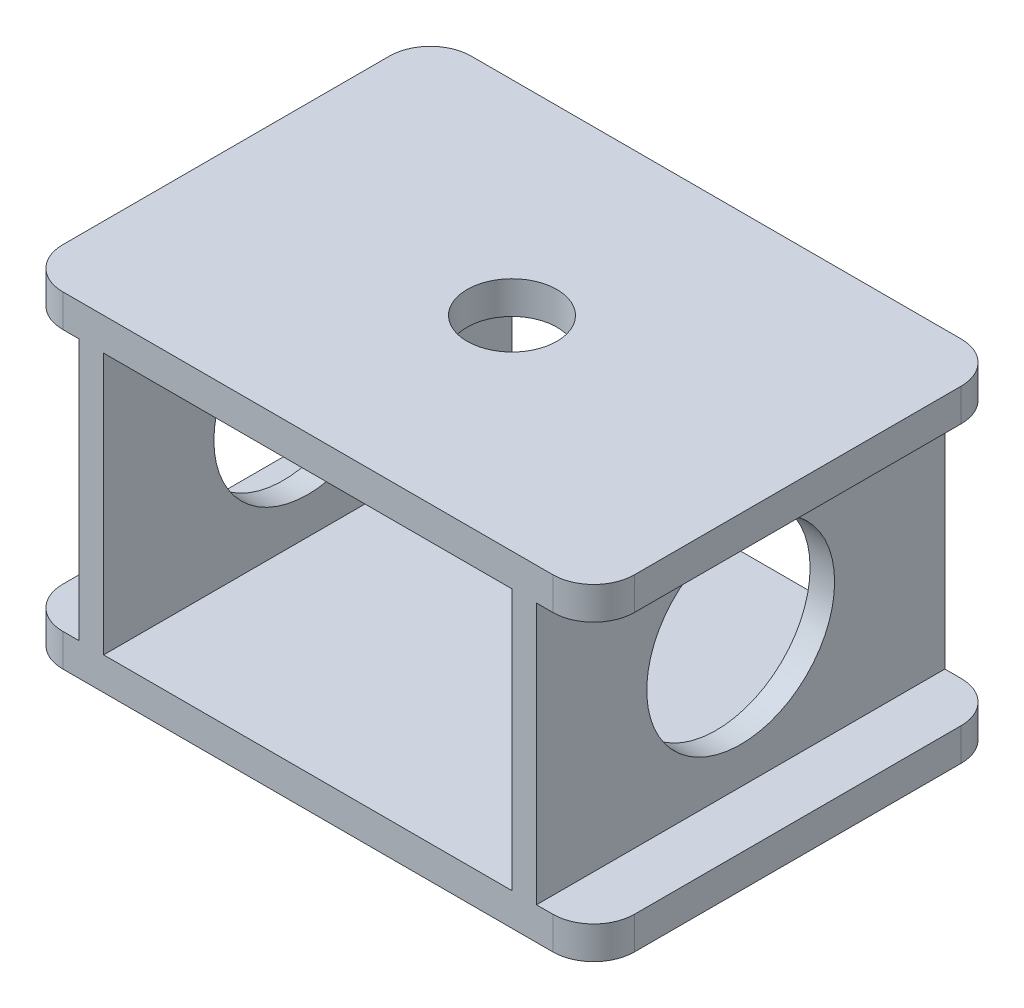
ISO-10303-21;
HEADER;
FILE_DESCRIPTION(('STEP AP214'),'2;1');
FILE_NAME('part.step','',(''),(''),'','','');
FILE_SCHEMA(('AUTOMOTIVE_DESIGN { 1 0 10303 214 1 1 1 1 }'));
ENDSEC;
DATA;
#1=APPLICATION_CONTEXT('core data for automotive mechanical design processes');
#2=APPLICATION_PROTOCOL_DEFINITION('international standard','automotive_design',2000,#1);
#3=PRODUCT_CONTEXT('',#1,'mechanical');
#4=PRODUCT('Part','Part','',(#3));
#5=PRODUCT_RELATED_PRODUCT_CATEGORY('part','',(#4));
#6=PRODUCT_DEFINITION_FORMATION('','',#4);
#7=PRODUCT_DEFINITION_CONTEXT('part definition',#1,'design');
#8=PRODUCT_DEFINITION('design','',#6,#7);
#9=PRODUCT_DEFINITION_SHAPE('','',#8);
#10=(LENGTH_UNIT() NAMED_UNIT(*) SI_UNIT(.MILLI.,.METRE.));
#11=(NAMED_UNIT(*) PLANE_ANGLE_UNIT() SI_UNIT($,.RADIAN.));
#12=(NAMED_UNIT(*) SI_UNIT($,.STERADIAN.) SOLID_ANGLE_UNIT());
#13=UNCERTAINTY_MEASURE_WITH_UNIT(LENGTH_MEASURE(1.E-05),#10,'distance_accuracy_value','');
#14=(GEOMETRIC_REPRESENTATION_CONTEXT(3) GLOBAL_UNCERTAINTY_ASSIGNED_CONTEXT((#13)) GLOBAL_UNIT_ASSIGNED_CONTEXT((#10,
#11,#12)) REPRESENTATION_CONTEXT('',''));
#15=CARTESIAN_POINT('',(0.,0.,0.));
#16=DIRECTION('',(0.,0.,1.));
#17=DIRECTION('',(1.,0.,0.));
#18=AXIS2_PLACEMENT_3D('',#15,#16,#17);
#19=CARTESIAN_POINT('',(30.,4.,20.));
#20=DIRECTION('',(0.,1.,0.));
#21=DIRECTION('',(0.,0.,1.));
#22=AXIS2_PLACEMENT_3D('',#19,#20,#21);
#23=PLANE('',#22);
#24=DIRECTION('',(0.,0.,1.));
#25=VECTOR('',#24,1.);
#26=CARTESIAN_POINT('',(-28.,4.,-25.));
#27=LINE('',#26,#25);
#28=CARTESIAN_POINT('',(-28.,4.,-25.));
#29=VERTEX_POINT('',#28);
#30=CARTESIAN_POINT('',(-28.,4.,25.));
#31=VERTEX_POINT('',#30);
#32=EDGE_CURVE('E322',#29,#31,#27,.T.);
#33=ORIENTED_EDGE('',*,*,#32,.F.);
#34=DIRECTION('',(-1.,0.,0.));
#35=VECTOR('',#34,1.);
#36=CARTESIAN_POINT('',(-30.,4.,-25.));
#37=LINE('',#36,#35);
#38=CARTESIAN_POINT('',(-30.,4.,-25.));
#39=VERTEX_POINT('',#38);
#40=EDGE_CURVE('E384',#29,#39,#37,.T.);
#41=ORIENTED_EDGE('',*,*,#40,.T.);
#42=CARTESIAN_POINT('',(-30.,4.,-20.));
#43=DIRECTION('',(0.,1.,0.));
#44=DIRECTION('',(0.,0.,1.));
#45=AXIS2_PLACEMENT_3D('',#42,#43,#44);
#46=CIRCLE('',#45,5.);
#47=CARTESIAN_POINT('',(-35.,4.,-20.));
#48=VERTEX_POINT('',#47);
#49=EDGE_CURVE('E388',#39,#48,#46,.T.);
#50=ORIENTED_EDGE('',*,*,#49,.T.);
#51=DIRECTION('',(0.,0.,1.));
#52=VECTOR('',#51,1.);
#53=CARTESIAN_POINT('',(-35.,4.,-20.));
#54=LINE('',#53,#52);
#55=CARTESIAN_POINT('',(-35.,4.,20.));
#56=VERTEX_POINT('',#55);
#57=EDGE_CURVE('E392',#48,#56,#54,.T.);
#58=ORIENTED_EDGE('',*,*,#57,.T.);
#59=CARTESIAN_POINT('',(-30.,4.,20.));
#60=DIRECTION('',(0.,1.,0.));
#61=DIRECTION('',(0.,0.,1.));
#62=AXIS2_PLACEMENT_3D('',#59,#60,#61);
#63=CIRCLE('',#62,5.);
#64=CARTESIAN_POINT('',(-30.,4.,25.));
#65=VERTEX_POINT('',#64);
#66=EDGE_CURVE('E395',#56,#65,#63,.T.);
#67=ORIENTED_EDGE('',*,*,#66,.T.);
#68=DIRECTION('',(1.,0.,0.));
#69=VECTOR('',#68,1.);
#70=CARTESIAN_POINT('',(-30.,4.,25.));
#71=LINE('',#70,#69);
#72=EDGE_CURVE('E399',#65,#31,#71,.T.);
#73=ORIENTED_EDGE('',*,*,#72,.T.);
#74=EDGE_LOOP('',(#33,#41,#50,#58,#67,#73));
#75=FACE_BOUND('',#74,.T.);
#76=ADVANCED_FACE('F45',(#75),#23,.T.);
#77=DIRECTION('',(0.,0.,-1.));
#78=VECTOR('',#77,1.);
#79=CARTESIAN_POINT('',(-25.,4.,-25.));
#80=LINE('',#79,#78);
#81=CARTESIAN_POINT('',(-25.,4.,25.));
#82=VERTEX_POINT('',#81);
#83=CARTESIAN_POINT('',(-25.,4.,-25.));
#84=VERTEX_POINT('',#83);
#85=EDGE_CURVE('E317',#82,#84,#80,.T.);
#86=ORIENTED_EDGE('',*,*,#85,.F.);
#87=CARTESIAN_POINT('',(25.,4.,25.));
#88=VERTEX_POINT('',#87);
#89=EDGE_CURVE('E70',#82,#88,#71,.T.);
#90=ORIENTED_EDGE('',*,*,#89,.T.);
#91=DIRECTION('',(0.,0.,1.));
#92=VECTOR('',#91,1.);
#93=CARTESIAN_POINT('',(25.,4.,-25.));
#94=LINE('',#93,#92);
#95=CARTESIAN_POINT('',(25.,4.,-25.));
#96=VERTEX_POINT('',#95);
#97=EDGE_CURVE('E326',#96,#88,#94,.T.);
#98=ORIENTED_EDGE('',*,*,#97,.F.);
#99=EDGE_CURVE('E389',#96,#84,#37,.T.);
#100=ORIENTED_EDGE('',*,*,#99,.T.);
#101=EDGE_LOOP('',(#86,#90,#98,#100));
#102=FACE_BOUND('',#101,.T.);
#103=ADVANCED_FACE('F477',(#102),#23,.T.);
#104=CARTESIAN_POINT('',(30.,4.,20.));
#105=DIRECTION('',(0.,-1.,0.));
#106=DIRECTION('',(0.,0.,-1.));
#107=AXIS2_PLACEMENT_3D('',#104,#105,#106);
#108=CYLINDRICAL_SURFACE('',#107,5.);
#109=CARTESIAN_POINT('',(30.,0.,20.));
#110=DIRECTION('',(0.,1.,0.));
#111=DIRECTION('',(0.,0.,1.));
#112=AXIS2_PLACEMENT_3D('',#109,#110,#111);
#113=CIRCLE('',#112,5.);
#114=CARTESIAN_POINT('',(30.,0.,25.));
#115=VERTEX_POINT('',#114);
#116=CARTESIAN_POINT('',(35.,0.,20.));
#117=VERTEX_POINT('',#116);
#118=EDGE_CURVE('E345',#115,#117,#113,.T.);
#119=ORIENTED_EDGE('',*,*,#118,.T.);
#120=DIRECTION('',(0.,-1.,0.));
#121=VECTOR('',#120,1.);
#122=CARTESIAN_POINT('',(35.,4.,20.));
#123=LINE('',#122,#121);
#124=CARTESIAN_POINT('',(35.,4.,20.));
#125=VERTEX_POINT('',#124);
#126=EDGE_CURVE('E11',#125,#117,#123,.T.);
#127=ORIENTED_EDGE('',*,*,#126,.F.);
#128=CARTESIAN_POINT('',(30.,4.,20.));
#129=DIRECTION('',(0.,1.,0.));
#130=DIRECTION('',(0.,0.,1.));
#131=AXIS2_PLACEMENT_3D('',#128,#129,#130);
#132=CIRCLE('',#131,5.);
#133=CARTESIAN_POINT('',(30.,4.,25.));
#134=VERTEX_POINT('',#133);
#135=EDGE_CURVE('E373',#134,#125,#132,.T.);
#136=ORIENTED_EDGE('',*,*,#135,.F.);
#137=DIRECTION('',(0.,-1.,0.));
#138=VECTOR('',#137,1.);
#139=CARTESIAN_POINT('',(30.,4.,25.));
#140=LINE('',#139,#138);
#141=EDGE_CURVE('E402',#134,#115,#140,.T.);
#142=ORIENTED_EDGE('',*,*,#141,.T.);
#143=EDGE_LOOP('',(#119,#127,#136,#142));
#144=FACE_BOUND('',#143,.T.);
#145=ADVANCED_FACE('F47',(#144),#108,.T.);
#146=CARTESIAN_POINT('',(35.,4.,-20.));
#147=DIRECTION('',(-1.,0.,0.));
#148=DIRECTION('',(0.,0.,1.));
#149=AXIS2_PLACEMENT_3D('',#146,#147,#148);
#150=PLANE('',#149);
#151=DIRECTION('',(0.,0.,-1.));
#152=VECTOR('',#151,1.);
#153=CARTESIAN_POINT('',(35.,0.,-20.));
#154=LINE('',#153,#152);
#155=CARTESIAN_POINT('',(35.,0.,-20.));
#156=VERTEX_POINT('',#155);
#157=EDGE_CURVE('E406',#117,#156,#154,.T.);
#158=ORIENTED_EDGE('',*,*,#157,.T.);
#159=DIRECTION('',(0.,-1.,0.));
#160=VECTOR('',#159,1.);
#161=CARTESIAN_POINT('',(35.,4.,-20.));
#162=LINE('',#161,#160);
#163=CARTESIAN_POINT('',(35.,4.,-20.));
#164=VERTEX_POINT('',#163);
#165=EDGE_CURVE('E55',#164,#156,#162,.T.);
#166=ORIENTED_EDGE('',*,*,#165,.F.);
#167=DIRECTION('',(0.,0.,-1.));
#168=VECTOR('',#167,1.);
#169=CARTESIAN_POINT('',(35.,4.,-20.));
#170=LINE('',#169,#168);
#171=EDGE_CURVE('E377',#125,#164,#170,.T.);
#172=ORIENTED_EDGE('',*,*,#171,.F.);
#173=ORIENTED_EDGE('',*,*,#126,.T.);
#174=EDGE_LOOP('',(#158,#166,#172,#173));
#175=FACE_BOUND('',#174,.T.);
#176=ADVANCED_FACE('F568',(#175),#150,.F.);
#177=CARTESIAN_POINT('',(30.,4.,-20.));
#178=DIRECTION('',(0.,-1.,0.));
#179=DIRECTION('',(0.,0.,-1.));
#180=AXIS2_PLACEMENT_3D('',#177,#178,#179);
#181=CYLINDRICAL_SURFACE('',#180,5.);
#182=CARTESIAN_POINT('',(30.,0.,-20.));
#183=DIRECTION('',(0.,1.,0.));
#184=DIRECTION('',(0.,0.,-1.));
#185=AXIS2_PLACEMENT_3D('',#182,#183,#184);
#186=CIRCLE('',#185,5.);
#187=CARTESIAN_POINT('',(30.,0.,-25.));
#188=VERTEX_POINT('',#187);
#189=EDGE_CURVE('E409',#156,#188,#186,.T.);
#190=ORIENTED_EDGE('',*,*,#189,.T.);
#191=DIRECTION('',(0.,-1.,0.));
#192=VECTOR('',#191,1.);
#193=CARTESIAN_POINT('',(30.,4.,-25.));
#194=LINE('',#193,#192);
#195=CARTESIAN_POINT('',(30.,4.,-25.));
#196=VERTEX_POINT('',#195);
#197=EDGE_CURVE('E445',#196,#188,#194,.T.);
#198=ORIENTED_EDGE('',*,*,#197,.F.);
#199=CARTESIAN_POINT('',(30.,4.,-20.));
#200=DIRECTION('',(0.,1.,0.));
#201=DIRECTION('',(0.,0.,-1.));
#202=AXIS2_PLACEMENT_3D('',#199,#200,#201);
#203=CIRCLE('',#202,5.);
#204=EDGE_CURVE('E381',#164,#196,#203,.T.);
#205=ORIENTED_EDGE('',*,*,#204,.F.);
#206=ORIENTED_EDGE('',*,*,#165,.T.);
#207=EDGE_LOOP('',(#190,#198,#205,#206));
#208=FACE_BOUND('',#207,.T.);
#209=ADVANCED_FACE('F455',(#208),#181,.T.);
#210=CARTESIAN_POINT('',(-30.,4.,-25.));
#211=DIRECTION('',(0.,0.,1.));
#212=DIRECTION('',(1.,0.,0.));
#213=AXIS2_PLACEMENT_3D('',#210,#211,#212);
#214=PLANE('',#213);
#215=DIRECTION('',(0.,-1.,0.));
#216=VECTOR('',#215,1.);
#217=CARTESIAN_POINT('',(25.,36.,-25.));
#218=LINE('',#217,#216);
#219=CARTESIAN_POINT('',(25.,36.,-25.));
#220=VERTEX_POINT('',#219);
#221=EDGE_CURVE('E356',#220,#96,#218,.T.);
#222=ORIENTED_EDGE('',*,*,#221,.F.);
#223=DIRECTION('',(-1.,0.,0.));
#224=VECTOR('',#223,1.);
#225=CARTESIAN_POINT('',(30.,36.,-25.));
#226=LINE('',#225,#224);
#227=CARTESIAN_POINT('',(-25.,36.,-25.));
#228=VERTEX_POINT('',#227);
#229=EDGE_CURVE('E287',#220,#228,#226,.T.);
#230=ORIENTED_EDGE('',*,*,#229,.T.);
#231=DIRECTION('',(0.,-1.,0.));
#232=VECTOR('',#231,1.);
#233=CARTESIAN_POINT('',(-25.,36.,-25.));
#234=LINE('',#233,#232);
#235=EDGE_CURVE('E333',#228,#84,#234,.T.);
#236=ORIENTED_EDGE('',*,*,#235,.T.);
#237=ORIENTED_EDGE('',*,*,#99,.F.);
#238=EDGE_LOOP('',(#222,#230,#236,#237));
#239=FACE_BOUND('',#238,.T.);
#240=DIRECTION('',(-1.,0.,0.));
#241=VECTOR('',#240,1.);
#242=CARTESIAN_POINT('',(-30.,0.,-25.));
#243=LINE('',#242,#241);
#244=CARTESIAN_POINT('',(-30.,0.,-25.));
#245=VERTEX_POINT('',#244);
#246=EDGE_CURVE('E412',#188,#245,#243,.T.);
#247=ORIENTED_EDGE('',*,*,#246,.T.);
#248=DIRECTION('',(0.,-1.,0.));
#249=VECTOR('',#248,1.);
#250=CARTESIAN_POINT('',(-30.,4.,-25.));
#251=LINE('',#250,#249);
#252=EDGE_CURVE('E441',#39,#245,#251,.T.);
#253=ORIENTED_EDGE('',*,*,#252,.F.);
#254=ORIENTED_EDGE('',*,*,#40,.F.);
#255=DIRECTION('',(0.,-1.,0.));
#256=VECTOR('',#255,1.);
#257=CARTESIAN_POINT('',(-28.,36.,-25.));
#258=LINE('',#257,#256);
#259=CARTESIAN_POINT('',(-28.,36.,-25.));
#260=VERTEX_POINT('',#259);
#261=EDGE_CURVE('E321',#260,#29,#258,.T.);
#262=ORIENTED_EDGE('',*,*,#261,.F.);
#263=CARTESIAN_POINT('',(-30.,36.,-25.));
#264=VERTEX_POINT('',#263);
#265=EDGE_CURVE('E226',#260,#264,#226,.T.);
#266=ORIENTED_EDGE('',*,*,#265,.T.);
#267=DIRECTION('',(0.,-1.,0.));
#268=VECTOR('',#267,1.);
#269=CARTESIAN_POINT('',(-30.,40.,-25.));
#270=LINE('',#269,#268);
#271=CARTESIAN_POINT('',(-30.,40.,-25.));
#272=VERTEX_POINT('',#271);
#273=EDGE_CURVE('E222',#272,#264,#270,.T.);
#274=ORIENTED_EDGE('',*,*,#273,.F.);
#275=DIRECTION('',(-1.,0.,0.));
#276=VECTOR('',#275,1.);
#277=CARTESIAN_POINT('',(28.,40.,-25.));
#278=LINE('',#277,#276);
#279=CARTESIAN_POINT('',(30.,40.,-25.));
#280=VERTEX_POINT('',#279);
#281=EDGE_CURVE('E207',#280,#272,#278,.T.);
#282=ORIENTED_EDGE('',*,*,#281,.F.);
#283=DIRECTION('',(0.,-1.,0.));
#284=VECTOR('',#283,1.);
#285=CARTESIAN_POINT('',(30.,40.,-25.));
#286=LINE('',#285,#284);
#287=CARTESIAN_POINT('',(30.,36.,-25.));
#288=VERTEX_POINT('',#287);
#289=EDGE_CURVE('E257',#280,#288,#286,.T.);
#290=ORIENTED_EDGE('',*,*,#289,.T.);
#291=CARTESIAN_POINT('',(28.,36.,-25.));
#292=VERTEX_POINT('',#291);
#293=EDGE_CURVE('E219',#288,#292,#226,.T.);
#294=ORIENTED_EDGE('',*,*,#293,.T.);
#295=DIRECTION('',(0.,-1.,0.));
#296=VECTOR('',#295,1.);
#297=CARTESIAN_POINT('',(28.,36.,-25.));
#298=LINE('',#297,#296);
#299=CARTESIAN_POINT('',(28.,4.,-25.));
#300=VERTEX_POINT('',#299);
#301=EDGE_CURVE('E352',#292,#300,#298,.T.);
#302=ORIENTED_EDGE('',*,*,#301,.T.);
#303=EDGE_CURVE('E385',#196,#300,#37,.T.);
#304=ORIENTED_EDGE('',*,*,#303,.F.);
#305=ORIENTED_EDGE('',*,*,#197,.T.);
#306=EDGE_LOOP('',(#247,#253,#254,#262,#266,#274,#282,#290,#294,#302,#304,#305));
#307=FACE_BOUND('',#306,.T.);
#308=ADVANCED_FACE('F223',(#239,#307),#214,.F.);
#309=CARTESIAN_POINT('',(-30.,4.,-20.));
#310=DIRECTION('',(0.,-1.,0.));
#311=DIRECTION('',(0.,0.,-1.));
#312=AXIS2_PLACEMENT_3D('',#309,#310,#311);
#313=CYLINDRICAL_SURFACE('',#312,5.);
#314=CARTESIAN_POINT('',(-30.,0.,-20.));
#315=DIRECTION('',(0.,1.,0.));
#316=DIRECTION('',(0.,0.,1.));
#317=AXIS2_PLACEMENT_3D('',#314,#315,#316);
#318=CIRCLE('',#317,5.);
#319=CARTESIAN_POINT('',(-35.,0.,-20.));
#320=VERTEX_POINT('',#319);
#321=EDGE_CURVE('E415',#245,#320,#318,.T.);
#322=ORIENTED_EDGE('',*,*,#321,.T.);
#323=DIRECTION('',(0.,-1.,0.));
#324=VECTOR('',#323,1.);
#325=CARTESIAN_POINT('',(-35.,4.,-20.));
#326=LINE('',#325,#324);
#327=EDGE_CURVE('E437',#48,#320,#326,.T.);
#328=ORIENTED_EDGE('',*,*,#327,.F.);
#329=ORIENTED_EDGE('',*,*,#49,.F.);
#330=ORIENTED_EDGE('',*,*,#252,.T.);
#331=EDGE_LOOP('',(#322,#328,#329,#330));
#332=FACE_BOUND('',#331,.T.);
#333=ADVANCED_FACE('F469',(#332),#313,.T.);
#334=CARTESIAN_POINT('',(-35.,4.,-20.));
#335=DIRECTION('',(1.,0.,0.));
#336=DIRECTION('',(0.,0.,-1.));
#337=AXIS2_PLACEMENT_3D('',#334,#335,#336);
#338=PLANE('',#337);
#339=DIRECTION('',(0.,0.,1.));
#340=VECTOR('',#339,1.);
#341=CARTESIAN_POINT('',(-35.,0.,-20.));
#342=LINE('',#341,#340);
#343=CARTESIAN_POINT('',(-35.,0.,20.));
#344=VERTEX_POINT('',#343);
#345=EDGE_CURVE('E418',#320,#344,#342,.T.);
#346=ORIENTED_EDGE('',*,*,#345,.T.);
#347=DIRECTION('',(0.,-1.,0.));
#348=VECTOR('',#347,1.);
#349=CARTESIAN_POINT('',(-35.,4.,20.));
#350=LINE('',#349,#348);
#351=EDGE_CURVE('E433',#56,#344,#350,.T.);
#352=ORIENTED_EDGE('',*,*,#351,.F.);
#353=ORIENTED_EDGE('',*,*,#57,.F.);
#354=ORIENTED_EDGE('',*,*,#327,.T.);
#355=EDGE_LOOP('',(#346,#352,#353,#354));
#356=FACE_BOUND('',#355,.T.);
#357=ADVANCED_FACE('F556',(#356),#338,.F.);
#358=CARTESIAN_POINT('',(-30.,4.,20.));
#359=DIRECTION('',(0.,-1.,0.));
#360=DIRECTION('',(0.,0.,-1.));
#361=AXIS2_PLACEMENT_3D('',#358,#359,#360);
#362=CYLINDRICAL_SURFACE('',#361,5.);
#363=CARTESIAN_POINT('',(-30.,0.,20.));
#364=DIRECTION('',(0.,1.,0.));
#365=DIRECTION('',(0.,0.,1.));
#366=AXIS2_PLACEMENT_3D('',#363,#364,#365);
#367=CIRCLE('',#366,5.);
#368=CARTESIAN_POINT('',(-30.,0.,25.));
#369=VERTEX_POINT('',#368);
#370=EDGE_CURVE('E421',#344,#369,#367,.T.);
#371=ORIENTED_EDGE('',*,*,#370,.T.);
#372=DIRECTION('',(0.,-1.,0.));
#373=VECTOR('',#372,1.);
#374=CARTESIAN_POINT('',(-30.,4.,25.));
#375=LINE('',#374,#373);
#376=EDGE_CURVE('E429',#65,#369,#375,.T.);
#377=ORIENTED_EDGE('',*,*,#376,.F.);
#378=ORIENTED_EDGE('',*,*,#66,.F.);
#379=ORIENTED_EDGE('',*,*,#351,.T.);
#380=EDGE_LOOP('',(#371,#377,#378,#379));
#381=FACE_BOUND('',#380,.T.);
#382=ADVANCED_FACE('F550',(#381),#362,.T.);
#383=CARTESIAN_POINT('',(-30.,4.,25.));
#384=DIRECTION('',(0.,0.,-1.));
#385=DIRECTION('',(-1.,0.,0.));
#386=AXIS2_PLACEMENT_3D('',#383,#384,#385);
#387=PLANE('',#386);
#388=DIRECTION('',(0.,-1.,0.));
#389=VECTOR('',#388,1.);
#390=CARTESIAN_POINT('',(28.,36.,25.));
#391=LINE('',#390,#389);
#392=CARTESIAN_POINT('',(28.,36.,25.));
#393=VERTEX_POINT('',#392);
#394=CARTESIAN_POINT('',(28.,4.,25.));
#395=VERTEX_POINT('',#394);
#396=EDGE_CURVE('E348',#393,#395,#391,.T.);
#397=ORIENTED_EDGE('',*,*,#396,.F.);
#398=DIRECTION('',(1.,0.,0.));
#399=VECTOR('',#398,1.);
#400=CARTESIAN_POINT('',(28.,36.,25.));
#401=LINE('',#400,#399);
#402=CARTESIAN_POINT('',(30.,36.,25.));
#403=VERTEX_POINT('',#402);
#404=EDGE_CURVE('E269',#393,#403,#401,.T.);
#405=ORIENTED_EDGE('',*,*,#404,.T.);
#406=DIRECTION('',(0.,-1.,0.));
#407=VECTOR('',#406,1.);
#408=CARTESIAN_POINT('',(30.,40.,25.));
#409=LINE('',#408,#407);
#410=CARTESIAN_POINT('',(30.,40.,25.));
#411=VERTEX_POINT('',#410);
#412=EDGE_CURVE('E298',#411,#403,#409,.T.);
#413=ORIENTED_EDGE('',*,*,#412,.F.);
#414=DIRECTION('',(1.,0.,0.));
#415=VECTOR('',#414,1.);
#416=CARTESIAN_POINT('',(-30.,40.,25.));
#417=LINE('',#416,#415);
#418=CARTESIAN_POINT('',(-30.,40.,25.));
#419=VERTEX_POINT('',#418);
#420=EDGE_CURVE('E246',#419,#411,#417,.T.);
#421=ORIENTED_EDGE('',*,*,#420,.F.);
#422=DIRECTION('',(0.,-1.,0.));
#423=VECTOR('',#422,1.);
#424=CARTESIAN_POINT('',(-30.,40.,25.));
#425=LINE('',#424,#423);
#426=CARTESIAN_POINT('',(-30.,36.,25.));
#427=VERTEX_POINT('',#426);
#428=EDGE_CURVE('E302',#419,#427,#425,.T.);
#429=ORIENTED_EDGE('',*,*,#428,.T.);
#430=CARTESIAN_POINT('',(-28.,36.,25.));
#431=VERTEX_POINT('',#430);
#432=EDGE_CURVE('E270',#427,#431,#401,.T.);
#433=ORIENTED_EDGE('',*,*,#432,.T.);
#434=DIRECTION('',(0.,-1.,0.));
#435=VECTOR('',#434,1.);
#436=CARTESIAN_POINT('',(-28.,36.,25.));
#437=LINE('',#436,#435);
#438=EDGE_CURVE('E341',#431,#31,#437,.T.);
#439=ORIENTED_EDGE('',*,*,#438,.T.);
#440=ORIENTED_EDGE('',*,*,#72,.F.);
#441=ORIENTED_EDGE('',*,*,#376,.T.);
#442=DIRECTION('',(1.,0.,0.));
#443=VECTOR('',#442,1.);
#444=CARTESIAN_POINT('',(-30.,0.,25.));
#445=LINE('',#444,#443);
#446=EDGE_CURVE('E378',#369,#115,#445,.T.);
#447=ORIENTED_EDGE('',*,*,#446,.T.);
#448=ORIENTED_EDGE('',*,*,#141,.F.);
#449=EDGE_CURVE('E398',#395,#134,#71,.T.);
#450=ORIENTED_EDGE('',*,*,#449,.F.);
#451=EDGE_LOOP('',(#397,#405,#413,#421,#429,#433,#439,#440,#441,#447,#448,#450));
#452=FACE_BOUND('',#451,.T.);
#453=CARTESIAN_POINT('',(-25.,36.,25.));
#454=VERTEX_POINT('',#453);
#455=CARTESIAN_POINT('',(25.,36.,25.));
#456=VERTEX_POINT('',#455);
#457=EDGE_CURVE('E275',#454,#456,#401,.T.);
#458=ORIENTED_EDGE('',*,*,#457,.T.);
#459=DIRECTION('',(0.,-1.,0.));
#460=VECTOR('',#459,1.);
#461=CARTESIAN_POINT('',(25.,36.,25.));
#462=LINE('',#461,#460);
#463=EDGE_CURVE('E230',#456,#88,#462,.T.);
#464=ORIENTED_EDGE('',*,*,#463,.T.);
#465=ORIENTED_EDGE('',*,*,#89,.F.);
#466=DIRECTION('',(0.,-1.,0.));
#467=VECTOR('',#466,1.);
#468=CARTESIAN_POINT('',(-25.,36.,25.));
#469=LINE('',#468,#467);
#470=EDGE_CURVE('E337',#454,#82,#469,.T.);
#471=ORIENTED_EDGE('',*,*,#470,.F.);
#472=EDGE_LOOP('',(#458,#464,#465,#471));
#473=FACE_BOUND('',#472,.T.);
#474=ADVANCED_FACE('F544',(#452,#473),#387,.F.);
#475=DIRECTION('',(0.,0.,-1.));
#476=VECTOR('',#475,1.);
#477=CARTESIAN_POINT('',(28.,4.,-25.));
#478=LINE('',#477,#476);
#479=EDGE_CURVE('E62',#395,#300,#478,.T.);
#480=ORIENTED_EDGE('',*,*,#479,.F.);
#481=ORIENTED_EDGE('',*,*,#449,.T.);
#482=ORIENTED_EDGE('',*,*,#135,.T.);
#483=ORIENTED_EDGE('',*,*,#171,.T.);
#484=ORIENTED_EDGE('',*,*,#204,.T.);
#485=ORIENTED_EDGE('',*,*,#303,.T.);
#486=EDGE_LOOP('',(#480,#481,#482,#483,#484,#485));
#487=FACE_BOUND('',#486,.T.);
#488=ADVANCED_FACE('F536',(#487),#23,.T.);
#489=CARTESIAN_POINT('',(30.,0.,20.));
#490=DIRECTION('',(0.,1.,0.));
#491=DIRECTION('',(0.,0.,1.));
#492=AXIS2_PLACEMENT_3D('',#489,#490,#491);
#493=PLANE('',#492);
#494=ORIENTED_EDGE('',*,*,#118,.F.);
#495=ORIENTED_EDGE('',*,*,#446,.F.);
#496=ORIENTED_EDGE('',*,*,#370,.F.);
#497=ORIENTED_EDGE('',*,*,#345,.F.);
#498=ORIENTED_EDGE('',*,*,#321,.F.);
#499=ORIENTED_EDGE('',*,*,#246,.F.);
#500=ORIENTED_EDGE('',*,*,#189,.F.);
#501=ORIENTED_EDGE('',*,*,#157,.F.);
#502=EDGE_LOOP('',(#494,#495,#496,#497,#498,#499,#500,#501));
#503=FACE_BOUND('',#502,.T.);
#504=ADVANCED_FACE('F461',(#503),#493,.F.);
#505=CARTESIAN_POINT('',(25.,36.,-25.));
#506=DIRECTION('',(1.,0.,0.));
#507=DIRECTION('',(0.,0.,-1.));
#508=AXIS2_PLACEMENT_3D('',#505,#506,#507);
#509=PLANE('',#508);
#510=CARTESIAN_POINT('',(25.,20.,0.));
#511=DIRECTION('',(1.,0.,0.));
#512=DIRECTION('',(0.,0.,-1.));
#513=AXIS2_PLACEMENT_3D('',#510,#511,#512);
#514=CIRCLE('',#513,11.5);
#515=CARTESIAN_POINT('',(25.,20.,-11.5));
#516=VERTEX_POINT('',#515);
#517=EDGE_CURVE('E262',#516,#516,#514,.T.);
#518=ORIENTED_EDGE('',*,*,#517,.T.);
#519=EDGE_LOOP('',(#518));
#520=FACE_BOUND('',#519,.T.);
#521=ORIENTED_EDGE('',*,*,#97,.T.);
#522=ORIENTED_EDGE('',*,*,#463,.F.);
#523=DIRECTION('',(0.,0.,1.));
#524=VECTOR('',#523,1.);
#525=CARTESIAN_POINT('',(25.,36.,-25.));
#526=LINE('',#525,#524);
#527=EDGE_CURVE('E363',#220,#456,#526,.T.);
#528=ORIENTED_EDGE('',*,*,#527,.F.);
#529=ORIENTED_EDGE('',*,*,#221,.T.);
#530=EDGE_LOOP('',(#521,#522,#528,#529));
#531=FACE_BOUND('',#530,.T.);
#532=ADVANCED_FACE('F548',(#520,#531),#509,.F.);
#533=CARTESIAN_POINT('',(28.,36.,-25.));
#534=DIRECTION('',(-1.,0.,0.));
#535=DIRECTION('',(0.,0.,1.));
#536=AXIS2_PLACEMENT_3D('',#533,#534,#535);
#537=PLANE('',#536);
#538=CARTESIAN_POINT('',(28.,20.,0.));
#539=DIRECTION('',(1.,0.,0.));
#540=DIRECTION('',(0.,0.,-1.));
#541=AXIS2_PLACEMENT_3D('',#538,#539,#540);
#542=CIRCLE('',#541,11.5);
#543=CARTESIAN_POINT('',(28.,20.,-11.5));
#544=VERTEX_POINT('',#543);
#545=EDGE_CURVE('E500',#544,#544,#542,.T.);
#546=ORIENTED_EDGE('',*,*,#545,.F.);
#547=EDGE_LOOP('',(#546));
#548=FACE_BOUND('',#547,.T.);
#549=ORIENTED_EDGE('',*,*,#479,.T.);
#550=ORIENTED_EDGE('',*,*,#301,.F.);
#551=DIRECTION('',(0.,0.,-1.));
#552=VECTOR('',#551,1.);
#553=CARTESIAN_POINT('',(28.,36.,-25.));
#554=LINE('',#553,#552);
#555=EDGE_CURVE('E360',#393,#292,#554,.T.);
#556=ORIENTED_EDGE('',*,*,#555,.F.);
#557=ORIENTED_EDGE('',*,*,#396,.T.);
#558=EDGE_LOOP('',(#549,#550,#556,#557));
#559=FACE_BOUND('',#558,.T.);
#560=ADVANCED_FACE('F611',(#548,#559),#537,.F.);
#561=CARTESIAN_POINT('',(-28.,36.,-25.));
#562=DIRECTION('',(1.,0.,0.));
#563=DIRECTION('',(0.,0.,-1.));
#564=AXIS2_PLACEMENT_3D('',#561,#562,#563);
#565=PLANE('',#564);
#566=CARTESIAN_POINT('',(-28.,20.,0.));
#567=DIRECTION('',(1.,0.,0.));
#568=DIRECTION('',(0.,0.,-1.));
#569=AXIS2_PLACEMENT_3D('',#566,#567,#568);
#570=CIRCLE('',#569,11.5);
#571=CARTESIAN_POINT('',(-28.,20.,-11.5));
#572=VERTEX_POINT('',#571);
#573=EDGE_CURVE('E494',#572,#572,#570,.T.);
#574=ORIENTED_EDGE('',*,*,#573,.T.);
#575=EDGE_LOOP('',(#574));
#576=FACE_BOUND('',#575,.T.);
#577=ORIENTED_EDGE('',*,*,#32,.T.);
#578=ORIENTED_EDGE('',*,*,#438,.F.);
#579=DIRECTION('',(0.,0.,1.));
#580=VECTOR('',#579,1.);
#581=CARTESIAN_POINT('',(-28.,36.,-25.));
#582=LINE('',#581,#580);
#583=EDGE_CURVE('E312',#260,#431,#582,.T.);
#584=ORIENTED_EDGE('',*,*,#583,.F.);
#585=ORIENTED_EDGE('',*,*,#261,.T.);
#586=EDGE_LOOP('',(#577,#578,#584,#585));
#587=FACE_BOUND('',#586,.T.);
#588=ADVANCED_FACE('F527',(#576,#587),#565,.F.);
#589=CARTESIAN_POINT('',(-25.,36.,-25.));
#590=DIRECTION('',(-1.,0.,0.));
#591=DIRECTION('',(0.,0.,1.));
#592=AXIS2_PLACEMENT_3D('',#589,#590,#591);
#593=PLANE('',#592);
#594=CARTESIAN_POINT('',(-25.,20.,0.));
#595=DIRECTION('',(-1.,0.,0.));
#596=DIRECTION('',(0.,0.,1.));
#597=AXIS2_PLACEMENT_3D('',#594,#595,#596);
#598=CIRCLE('',#597,11.5);
#599=CARTESIAN_POINT('',(-25.,20.,11.5));
#600=VERTEX_POINT('',#599);
#601=EDGE_CURVE('E49',#600,#600,#598,.T.);
#602=ORIENTED_EDGE('',*,*,#601,.T.);
#603=EDGE_LOOP('',(#602));
#604=FACE_BOUND('',#603,.T.);
#605=ORIENTED_EDGE('',*,*,#85,.T.);
#606=ORIENTED_EDGE('',*,*,#235,.F.);
#607=DIRECTION('',(0.,0.,-1.));
#608=VECTOR('',#607,1.);
#609=CARTESIAN_POINT('',(-25.,36.,-25.));
#610=LINE('',#609,#608);
#611=EDGE_CURVE('E316',#454,#228,#610,.T.);
#612=ORIENTED_EDGE('',*,*,#611,.F.);
#613=ORIENTED_EDGE('',*,*,#470,.T.);
#614=EDGE_LOOP('',(#605,#606,#612,#613));
#615=FACE_BOUND('',#614,.T.);
#616=ADVANCED_FACE('F481',(#604,#615),#593,.F.);
#617=CARTESIAN_POINT('',(-30.,36.,-20.));
#618=DIRECTION('',(0.,1.,0.));
#619=DIRECTION('',(0.,0.,1.));
#620=AXIS2_PLACEMENT_3D('',#617,#618,#619);
#621=PLANE('',#620);
#622=CARTESIAN_POINT('',(0.,36.,0.));
#623=DIRECTION('',(0.,1.,0.));
#624=DIRECTION('',(0.,0.,1.));
#625=AXIS2_PLACEMENT_3D('',#622,#623,#624);
#626=CIRCLE('',#625,5.5);
#627=CARTESIAN_POINT('',(0.,36.,5.5));
#628=VERTEX_POINT('',#627);
#629=EDGE_CURVE('E507',#628,#628,#626,.F.);
#630=ORIENTED_EDGE('',*,*,#629,.F.);
#631=EDGE_LOOP('',(#630));
#632=FACE_BOUND('',#631,.T.);
#633=ORIENTED_EDGE('',*,*,#229,.F.);
#634=ORIENTED_EDGE('',*,*,#527,.T.);
#635=ORIENTED_EDGE('',*,*,#457,.F.);
#636=ORIENTED_EDGE('',*,*,#611,.T.);
#637=EDGE_LOOP('',(#633,#634,#635,#636));
#638=FACE_BOUND('',#637,.T.);
#639=ADVANCED_FACE('F515',(#632,#638),#621,.F.);
#640=ORIENTED_EDGE('',*,*,#404,.F.);
#641=ORIENTED_EDGE('',*,*,#555,.T.);
#642=ORIENTED_EDGE('',*,*,#293,.F.);
#643=CARTESIAN_POINT('',(30.,36.,-20.));
#644=DIRECTION('',(0.,1.,0.));
#645=DIRECTION('',(0.,0.,1.));
#646=AXIS2_PLACEMENT_3D('',#643,#644,#645);
#647=CIRCLE('',#646,5.);
#648=CARTESIAN_POINT('',(35.,36.,-20.));
#649=VERTEX_POINT('',#648);
#650=EDGE_CURVE('E281',#649,#288,#647,.T.);
#651=ORIENTED_EDGE('',*,*,#650,.F.);
#652=DIRECTION('',(0.,0.,-1.));
#653=VECTOR('',#652,1.);
#654=CARTESIAN_POINT('',(35.,36.,20.));
#655=LINE('',#654,#653);
#656=CARTESIAN_POINT('',(35.,36.,20.));
#657=VERTEX_POINT('',#656);
#658=EDGE_CURVE('E278',#657,#649,#655,.T.);
#659=ORIENTED_EDGE('',*,*,#658,.F.);
#660=CARTESIAN_POINT('',(30.,36.,20.));
#661=DIRECTION('',(0.,1.,0.));
#662=DIRECTION('',(0.,0.,1.));
#663=AXIS2_PLACEMENT_3D('',#660,#661,#662);
#664=CIRCLE('',#663,5.);
#665=EDGE_CURVE('E274',#403,#657,#664,.T.);
#666=ORIENTED_EDGE('',*,*,#665,.F.);
#667=EDGE_LOOP('',(#640,#641,#642,#651,#659,#666));
#668=FACE_BOUND('',#667,.T.);
#669=ADVANCED_FACE('F517',(#668),#621,.F.);
#670=ORIENTED_EDGE('',*,*,#265,.F.);
#671=ORIENTED_EDGE('',*,*,#583,.T.);
#672=ORIENTED_EDGE('',*,*,#432,.F.);
#673=CARTESIAN_POINT('',(-30.,36.,20.));
#674=DIRECTION('',(0.,1.,0.));
#675=DIRECTION('',(0.,0.,1.));
#676=AXIS2_PLACEMENT_3D('',#673,#674,#675);
#677=CIRCLE('',#676,5.);
#678=CARTESIAN_POINT('',(-35.,36.,20.));
#679=VERTEX_POINT('',#678);
#680=EDGE_CURVE('E265',#679,#427,#677,.T.);
#681=ORIENTED_EDGE('',*,*,#680,.F.);
#682=DIRECTION('',(0.,0.,1.));
#683=VECTOR('',#682,1.);
#684=CARTESIAN_POINT('',(-35.,36.,-20.));
#685=LINE('',#684,#683);
#686=CARTESIAN_POINT('',(-35.,36.,-20.));
#687=VERTEX_POINT('',#686);
#688=EDGE_CURVE('E261',#687,#679,#685,.T.);
#689=ORIENTED_EDGE('',*,*,#688,.F.);
#690=CARTESIAN_POINT('',(-30.,36.,-20.));
#691=DIRECTION('',(0.,1.,0.));
#692=DIRECTION('',(0.,0.,1.));
#693=AXIS2_PLACEMENT_3D('',#690,#691,#692);
#694=CIRCLE('',#693,5.);
#695=EDGE_CURVE('E258',#264,#687,#694,.T.);
#696=ORIENTED_EDGE('',*,*,#695,.F.);
#697=EDGE_LOOP('',(#670,#671,#672,#681,#689,#696));
#698=FACE_BOUND('',#697,.T.);
#699=ADVANCED_FACE('F519',(#698),#621,.F.);
#700=CARTESIAN_POINT('',(-30.,40.,-20.));
#701=DIRECTION('',(0.,-1.,0.));
#702=DIRECTION('',(0.,0.,-1.));
#703=AXIS2_PLACEMENT_3D('',#700,#701,#702);
#704=CYLINDRICAL_SURFACE('',#703,5.);
#705=ORIENTED_EDGE('',*,*,#695,.T.);
#706=DIRECTION('',(0.,-1.,0.));
#707=VECTOR('',#706,1.);
#708=CARTESIAN_POINT('',(-35.,40.,-20.));
#709=LINE('',#708,#707);
#710=CARTESIAN_POINT('',(-35.,40.,-20.));
#711=VERTEX_POINT('',#710);
#712=EDGE_CURVE('E231',#711,#687,#709,.T.);
#713=ORIENTED_EDGE('',*,*,#712,.F.);
#714=CARTESIAN_POINT('',(-30.,40.,-20.));
#715=DIRECTION('',(0.,1.,0.));
#716=DIRECTION('',(0.,0.,1.));
#717=AXIS2_PLACEMENT_3D('',#714,#715,#716);
#718=CIRCLE('',#717,5.);
#719=EDGE_CURVE('E211',#272,#711,#718,.T.);
#720=ORIENTED_EDGE('',*,*,#719,.F.);
#721=ORIENTED_EDGE('',*,*,#273,.T.);
#722=EDGE_LOOP('',(#705,#713,#720,#721));
#723=FACE_BOUND('',#722,.T.);
#724=ADVANCED_FACE('F233',(#723),#704,.T.);
#725=CARTESIAN_POINT('',(-35.,40.,-20.));
#726=DIRECTION('',(1.,0.,0.));
#727=DIRECTION('',(0.,0.,-1.));
#728=AXIS2_PLACEMENT_3D('',#725,#726,#727);
#729=PLANE('',#728);
#730=ORIENTED_EDGE('',*,*,#688,.T.);
#731=DIRECTION('',(0.,-1.,0.));
#732=VECTOR('',#731,1.);
#733=CARTESIAN_POINT('',(-35.,40.,20.));
#734=LINE('',#733,#732);
#735=CARTESIAN_POINT('',(-35.,40.,20.));
#736=VERTEX_POINT('',#735);
#737=EDGE_CURVE('E306',#736,#679,#734,.T.);
#738=ORIENTED_EDGE('',*,*,#737,.F.);
#739=DIRECTION('',(0.,0.,1.));
#740=VECTOR('',#739,1.);
#741=CARTESIAN_POINT('',(-35.,40.,-20.));
#742=LINE('',#741,#740);
#743=EDGE_CURVE('E237',#711,#736,#742,.T.);
#744=ORIENTED_EDGE('',*,*,#743,.F.);
#745=ORIENTED_EDGE('',*,*,#712,.T.);
#746=EDGE_LOOP('',(#730,#738,#744,#745));
#747=FACE_BOUND('',#746,.T.);
#748=ADVANCED_FACE('F586',(#747),#729,.F.);
#749=CARTESIAN_POINT('',(-30.,40.,20.));
#750=DIRECTION('',(0.,-1.,0.));
#751=DIRECTION('',(0.,0.,-1.));
#752=AXIS2_PLACEMENT_3D('',#749,#750,#751);
#753=CYLINDRICAL_SURFACE('',#752,5.);
#754=ORIENTED_EDGE('',*,*,#680,.T.);
#755=ORIENTED_EDGE('',*,*,#428,.F.);
#756=CARTESIAN_POINT('',(-30.,40.,20.));
#757=DIRECTION('',(0.,1.,0.));
#758=DIRECTION('',(0.,0.,1.));
#759=AXIS2_PLACEMENT_3D('',#756,#757,#758);
#760=CIRCLE('',#759,5.);
#761=EDGE_CURVE('E240',#736,#419,#760,.T.);
#762=ORIENTED_EDGE('',*,*,#761,.F.);
#763=ORIENTED_EDGE('',*,*,#737,.T.);
#764=EDGE_LOOP('',(#754,#755,#762,#763));
#765=FACE_BOUND('',#764,.T.);
#766=ADVANCED_FACE('F593',(#765),#753,.T.);
#767=CARTESIAN_POINT('',(30.,40.,20.));
#768=DIRECTION('',(0.,-1.,0.));
#769=DIRECTION('',(0.,0.,-1.));
#770=AXIS2_PLACEMENT_3D('',#767,#768,#769);
#771=CYLINDRICAL_SURFACE('',#770,5.);
#772=ORIENTED_EDGE('',*,*,#665,.T.);
#773=DIRECTION('',(0.,-1.,0.));
#774=VECTOR('',#773,1.);
#775=CARTESIAN_POINT('',(35.,40.,20.));
#776=LINE('',#775,#774);
#777=CARTESIAN_POINT('',(35.,40.,20.));
#778=VERTEX_POINT('',#777);
#779=EDGE_CURVE('E294',#778,#657,#776,.T.);
#780=ORIENTED_EDGE('',*,*,#779,.F.);
#781=CARTESIAN_POINT('',(30.,40.,20.));
#782=DIRECTION('',(0.,1.,0.));
#783=DIRECTION('',(0.,0.,1.));
#784=AXIS2_PLACEMENT_3D('',#781,#782,#783);
#785=CIRCLE('',#784,5.);
#786=EDGE_CURVE('E249',#411,#778,#785,.T.);
#787=ORIENTED_EDGE('',*,*,#786,.F.);
#788=ORIENTED_EDGE('',*,*,#412,.T.);
#789=EDGE_LOOP('',(#772,#780,#787,#788));
#790=FACE_BOUND('',#789,.T.);
#791=ADVANCED_FACE('F599',(#790),#771,.T.);
#792=CARTESIAN_POINT('',(35.,40.,20.));
#793=DIRECTION('',(-1.,0.,0.));
#794=DIRECTION('',(0.,0.,1.));
#795=AXIS2_PLACEMENT_3D('',#792,#793,#794);
#796=PLANE('',#795);
#797=ORIENTED_EDGE('',*,*,#658,.T.);
#798=DIRECTION('',(0.,-1.,0.));
#799=VECTOR('',#798,1.);
#800=CARTESIAN_POINT('',(35.,40.,-20.));
#801=LINE('',#800,#799);
#802=CARTESIAN_POINT('',(35.,40.,-20.));
#803=VERTEX_POINT('',#802);
#804=EDGE_CURVE('E290',#803,#649,#801,.T.);
#805=ORIENTED_EDGE('',*,*,#804,.F.);
#806=DIRECTION('',(0.,0.,-1.));
#807=VECTOR('',#806,1.);
#808=CARTESIAN_POINT('',(35.,40.,20.));
#809=LINE('',#808,#807);
#810=EDGE_CURVE('E252',#778,#803,#809,.T.);
#811=ORIENTED_EDGE('',*,*,#810,.F.);
#812=ORIENTED_EDGE('',*,*,#779,.T.);
#813=EDGE_LOOP('',(#797,#805,#811,#812));
#814=FACE_BOUND('',#813,.T.);
#815=ADVANCED_FACE('F603',(#814),#796,.F.);
#816=CARTESIAN_POINT('',(30.,40.,-20.));
#817=DIRECTION('',(0.,-1.,0.));
#818=DIRECTION('',(0.,0.,-1.));
#819=AXIS2_PLACEMENT_3D('',#816,#817,#818);
#820=CYLINDRICAL_SURFACE('',#819,5.);
#821=ORIENTED_EDGE('',*,*,#650,.T.);
#822=ORIENTED_EDGE('',*,*,#289,.F.);
#823=CARTESIAN_POINT('',(30.,40.,-20.));
#824=DIRECTION('',(0.,1.,0.));
#825=DIRECTION('',(0.,0.,1.));
#826=AXIS2_PLACEMENT_3D('',#823,#824,#825);
#827=CIRCLE('',#826,5.);
#828=EDGE_CURVE('E214',#803,#280,#827,.T.);
#829=ORIENTED_EDGE('',*,*,#828,.F.);
#830=ORIENTED_EDGE('',*,*,#804,.T.);
#831=EDGE_LOOP('',(#821,#822,#829,#830));
#832=FACE_BOUND('',#831,.T.);
#833=ADVANCED_FACE('F607',(#832),#820,.T.);
#834=CARTESIAN_POINT('',(-30.,40.,-20.));
#835=DIRECTION('',(0.,1.,0.));
#836=DIRECTION('',(0.,0.,1.));
#837=AXIS2_PLACEMENT_3D('',#834,#835,#836);
#838=PLANE('',#837);
#839=CARTESIAN_POINT('',(0.,40.,0.));
#840=DIRECTION('',(0.,1.,0.));
#841=DIRECTION('',(0.,0.,1.));
#842=AXIS2_PLACEMENT_3D('',#839,#840,#841);
#843=CIRCLE('',#842,5.5);
#844=CARTESIAN_POINT('',(0.,40.,5.5));
#845=VERTEX_POINT('',#844);
#846=EDGE_CURVE('E503',#845,#845,#843,.T.);
#847=ORIENTED_EDGE('',*,*,#846,.F.);
#848=EDGE_LOOP('',(#847));
#849=FACE_BOUND('',#848,.T.);
#850=ORIENTED_EDGE('',*,*,#281,.T.);
#851=ORIENTED_EDGE('',*,*,#719,.T.);
#852=ORIENTED_EDGE('',*,*,#743,.T.);
#853=ORIENTED_EDGE('',*,*,#761,.T.);
#854=ORIENTED_EDGE('',*,*,#420,.T.);
#855=ORIENTED_EDGE('',*,*,#786,.T.);
#856=ORIENTED_EDGE('',*,*,#810,.T.);
#857=ORIENTED_EDGE('',*,*,#828,.T.);
#858=EDGE_LOOP('',(#850,#851,#852,#853,#854,#855,#856,#857));
#859=FACE_BOUND('',#858,.T.);
#860=ADVANCED_FACE('F209',(#849,#859),#838,.T.);
#861=CARTESIAN_POINT('',(-35.,20.,0.));
#862=DIRECTION('',(1.,0.,0.));
#863=DIRECTION('',(0.,0.,-1.));
#864=AXIS2_PLACEMENT_3D('',#861,#862,#863);
#865=CYLINDRICAL_SURFACE('',#864,11.5);
#866=ORIENTED_EDGE('',*,*,#601,.F.);
#867=EDGE_LOOP('',(#866));
#868=FACE_BOUND('',#867,.T.);
#869=ORIENTED_EDGE('',*,*,#573,.F.);
#870=EDGE_LOOP('',(#869));
#871=FACE_BOUND('',#870,.T.);
#872=ADVANCED_FACE('F638',(#868,#871),#865,.F.);
#873=ORIENTED_EDGE('',*,*,#545,.T.);
#874=EDGE_LOOP('',(#873));
#875=FACE_BOUND('',#874,.T.);
#876=ORIENTED_EDGE('',*,*,#517,.F.);
#877=EDGE_LOOP('',(#876));
#878=FACE_BOUND('',#877,.T.);
#879=ADVANCED_FACE('F644',(#875,#878),#865,.F.);
#880=CARTESIAN_POINT('',(0.,-0.001000000000001,0.));
#881=DIRECTION('',(0.,1.,0.));
#882=DIRECTION('',(0.,0.,1.));
#883=AXIS2_PLACEMENT_3D('',#880,#881,#882);
#884=CYLINDRICAL_SURFACE('',#883,5.5);
#885=ORIENTED_EDGE('',*,*,#846,.T.);
#886=EDGE_LOOP('',(#885));
#887=FACE_BOUND('',#886,.T.);
#888=ORIENTED_EDGE('',*,*,#629,.T.);
#889=EDGE_LOOP('',(#888));
#890=FACE_BOUND('',#889,.T.);
#891=ADVANCED_FACE('F513',(#887,#890),#884,.F.);
#892=CLOSED_SHELL('',(#76,#103,#145,#176,#209,#308,#333,#357,#382,#474,#488,#504,#532,#560,#588,
#616,#639,#669,#699,#724,#748,#766,#791,#815,#833,#860,#872,#879,#891));
#893=MANIFOLD_SOLID_BREP('B2',#892);
#894=ADVANCED_BREP_SHAPE_REPRESENTATION('',(#18,#893),#14);
#895=SHAPE_DEFINITION_REPRESENTATION(#9,#894);
ENDSEC;
END-ISO-10303-21;
